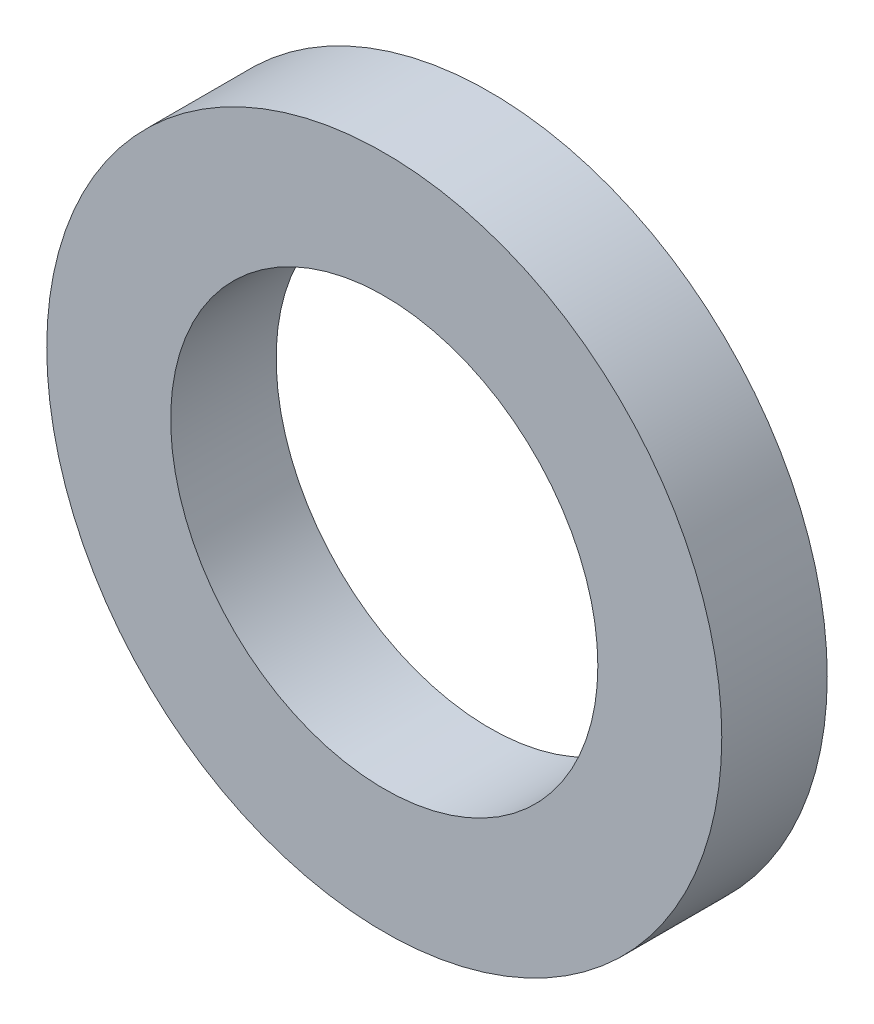
ISO-10303-21;
HEADER;
FILE_DESCRIPTION(('STEP AP214'),'2;1');
FILE_NAME('part.step','',(''),(''),'','','');
FILE_SCHEMA(('AUTOMOTIVE_DESIGN { 1 0 10303 214 1 1 1 1 }'));
ENDSEC;
DATA;
#1=APPLICATION_CONTEXT('core data for automotive mechanical design processes');
#2=APPLICATION_PROTOCOL_DEFINITION('international standard','automotive_design',2000,#1);
#3=PRODUCT_CONTEXT('',#1,'mechanical');
#4=PRODUCT('Part','Part','',(#3));
#5=PRODUCT_RELATED_PRODUCT_CATEGORY('part','',(#4));
#6=PRODUCT_DEFINITION_FORMATION('','',#4);
#7=PRODUCT_DEFINITION_CONTEXT('part definition',#1,'design');
#8=PRODUCT_DEFINITION('design','',#6,#7);
#9=PRODUCT_DEFINITION_SHAPE('','',#8);
#10=(LENGTH_UNIT() NAMED_UNIT(*) SI_UNIT(.MILLI.,.METRE.));
#11=(NAMED_UNIT(*) PLANE_ANGLE_UNIT() SI_UNIT($,.RADIAN.));
#12=(NAMED_UNIT(*) SI_UNIT($,.STERADIAN.) SOLID_ANGLE_UNIT());
#13=UNCERTAINTY_MEASURE_WITH_UNIT(LENGTH_MEASURE(1.E-05),#10,'distance_accuracy_value','');
#14=(GEOMETRIC_REPRESENTATION_CONTEXT(3) GLOBAL_UNCERTAINTY_ASSIGNED_CONTEXT((#13)) GLOBAL_UNIT_ASSIGNED_CONTEXT((#10,
#11,#12)) REPRESENTATION_CONTEXT('',''));
#15=CARTESIAN_POINT('',(0.,0.,0.));
#16=DIRECTION('',(0.,0.,1.));
#17=DIRECTION('',(1.,0.,0.));
#18=AXIS2_PLACEMENT_3D('',#15,#16,#17);
#19=CARTESIAN_POINT('',(0.,0.,2.));
#20=DIRECTION('',(0.,0.,1.));
#21=DIRECTION('',(1.,0.,0.));
#22=AXIS2_PLACEMENT_3D('',#19,#20,#21);
#23=PLANE('',#22);
#24=CARTESIAN_POINT('',(0.,0.,2.));
#25=DIRECTION('',(0.,0.,1.));
#26=DIRECTION('',(1.,0.,0.));
#27=AXIS2_PLACEMENT_3D('',#24,#25,#26);
#28=CIRCLE('',#27,6.4);
#29=CARTESIAN_POINT('',(6.4,0.,2.));
#30=VERTEX_POINT('',#29);
#31=EDGE_CURVE('E10',#30,#30,#28,.T.);
#32=ORIENTED_EDGE('',*,*,#31,.T.);
#33=EDGE_LOOP('',(#32));
#34=FACE_BOUND('',#33,.T.);
#35=CARTESIAN_POINT('',(0.,0.,2.));
#36=DIRECTION('',(0.,0.,1.));
#37=DIRECTION('',(1.,0.,0.));
#38=AXIS2_PLACEMENT_3D('',#35,#36,#37);
#39=CIRCLE('',#38,4.05);
#40=CARTESIAN_POINT('',(4.05,0.,2.));
#41=VERTEX_POINT('',#40);
#42=EDGE_CURVE('E48',#41,#41,#39,.T.);
#43=ORIENTED_EDGE('',*,*,#42,.F.);
#44=EDGE_LOOP('',(#43));
#45=FACE_BOUND('',#44,.T.);
#46=ADVANCED_FACE('F34',(#34,#45),#23,.T.);
#47=CARTESIAN_POINT('',(0.,0.,0.));
#48=DIRECTION('',(0.,0.,1.));
#49=DIRECTION('',(1.,0.,0.));
#50=AXIS2_PLACEMENT_3D('',#47,#48,#49);
#51=PLANE('',#50);
#52=CARTESIAN_POINT('',(0.,0.,0.));
#53=DIRECTION('',(0.,0.,1.));
#54=DIRECTION('',(1.,0.,0.));
#55=AXIS2_PLACEMENT_3D('',#52,#53,#54);
#56=CIRCLE('',#55,6.4);
#57=CARTESIAN_POINT('',(6.4,0.,0.));
#58=VERTEX_POINT('',#57);
#59=EDGE_CURVE('E38',#58,#58,#56,.T.);
#60=ORIENTED_EDGE('',*,*,#59,.F.);
#61=EDGE_LOOP('',(#60));
#62=FACE_BOUND('',#61,.T.);
#63=CARTESIAN_POINT('',(0.,0.,0.));
#64=DIRECTION('',(0.,0.,1.));
#65=DIRECTION('',(1.,0.,0.));
#66=AXIS2_PLACEMENT_3D('',#63,#64,#65);
#67=CIRCLE('',#66,4.05);
#68=CARTESIAN_POINT('',(4.05,0.,0.));
#69=VERTEX_POINT('',#68);
#70=EDGE_CURVE('E50',#69,#69,#67,.T.);
#71=ORIENTED_EDGE('',*,*,#70,.T.);
#72=EDGE_LOOP('',(#71));
#73=FACE_BOUND('',#72,.T.);
#74=ADVANCED_FACE('F63',(#62,#73),#51,.F.);
#75=CARTESIAN_POINT('',(0.,0.,2.));
#76=DIRECTION('',(0.,0.,-1.));
#77=DIRECTION('',(-1.,0.,0.));
#78=AXIS2_PLACEMENT_3D('',#75,#76,#77);
#79=CYLINDRICAL_SURFACE('',#78,6.4);
#80=ORIENTED_EDGE('',*,*,#31,.F.);
#81=EDGE_LOOP('',(#80));
#82=FACE_BOUND('',#81,.T.);
#83=ORIENTED_EDGE('',*,*,#59,.T.);
#84=EDGE_LOOP('',(#83));
#85=FACE_BOUND('',#84,.T.);
#86=ADVANCED_FACE('F36',(#82,#85),#79,.T.);
#87=CARTESIAN_POINT('',(0.,0.,2.));
#88=DIRECTION('',(0.,0.,-1.));
#89=DIRECTION('',(-1.,0.,0.));
#90=AXIS2_PLACEMENT_3D('',#87,#88,#89);
#91=CYLINDRICAL_SURFACE('',#90,4.05);
#92=ORIENTED_EDGE('',*,*,#42,.T.);
#93=EDGE_LOOP('',(#92));
#94=FACE_BOUND('',#93,.T.);
#95=ORIENTED_EDGE('',*,*,#70,.F.);
#96=EDGE_LOOP('',(#95));
#97=FACE_BOUND('',#96,.T.);
#98=ADVANCED_FACE('F59',(#94,#97),#91,.F.);
#99=CLOSED_SHELL('',(#46,#74,#86,#98));
#100=MANIFOLD_SOLID_BREP('B2',#99);
#101=ADVANCED_BREP_SHAPE_REPRESENTATION('',(#18,#100),#14);
#102=SHAPE_DEFINITION_REPRESENTATION(#9,#101);
ENDSEC;
END-ISO-10303-21;
